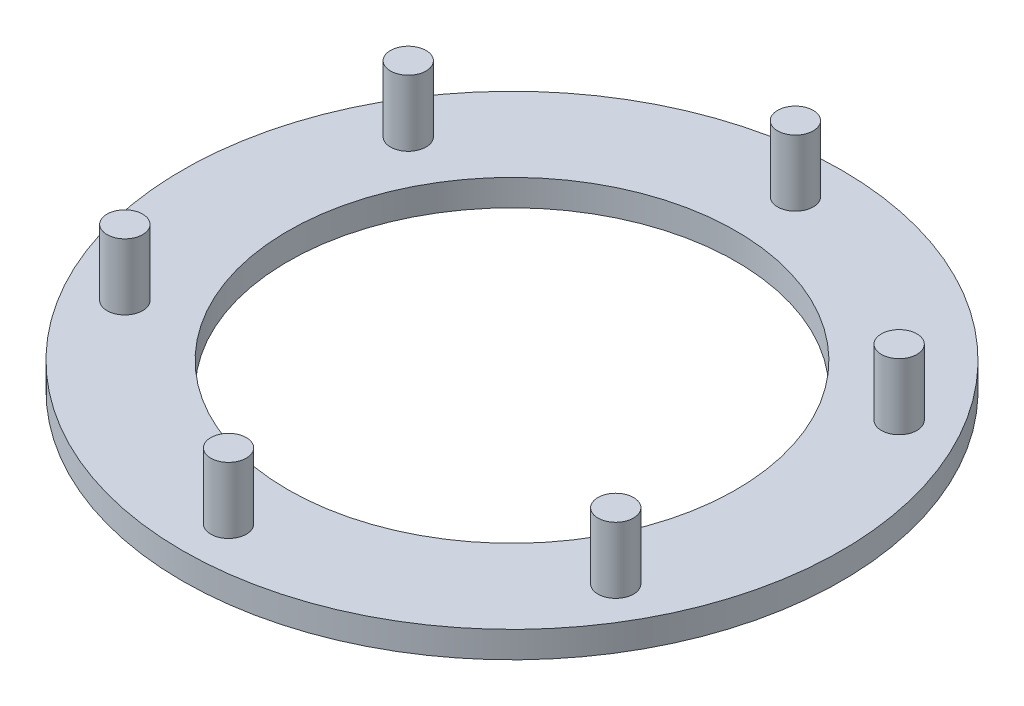
ISO-10303-21;
HEADER;
FILE_DESCRIPTION(('STEP AP214'),'2;1');
FILE_NAME('part.step','',(''),(''),'','','');
FILE_SCHEMA(('AUTOMOTIVE_DESIGN { 1 0 10303 214 1 1 1 1 }'));
ENDSEC;
DATA;
#1=APPLICATION_CONTEXT('core data for automotive mechanical design processes');
#2=APPLICATION_PROTOCOL_DEFINITION('international standard','automotive_design',2000,#1);
#3=PRODUCT_CONTEXT('',#1,'mechanical');
#4=PRODUCT('Part','Part','',(#3));
#5=PRODUCT_RELATED_PRODUCT_CATEGORY('part','',(#4));
#6=PRODUCT_DEFINITION_FORMATION('','',#4);
#7=PRODUCT_DEFINITION_CONTEXT('part definition',#1,'design');
#8=PRODUCT_DEFINITION('design','',#6,#7);
#9=PRODUCT_DEFINITION_SHAPE('','',#8);
#10=(LENGTH_UNIT() NAMED_UNIT(*) SI_UNIT(.MILLI.,.METRE.));
#11=(NAMED_UNIT(*) PLANE_ANGLE_UNIT() SI_UNIT($,.RADIAN.));
#12=(NAMED_UNIT(*) SI_UNIT($,.STERADIAN.) SOLID_ANGLE_UNIT());
#13=UNCERTAINTY_MEASURE_WITH_UNIT(LENGTH_MEASURE(1.E-05),#10,'distance_accuracy_value','');
#14=(GEOMETRIC_REPRESENTATION_CONTEXT(3) GLOBAL_UNCERTAINTY_ASSIGNED_CONTEXT((#13)) GLOBAL_UNIT_ASSIGNED_CONTEXT((#10,
#11,#12)) REPRESENTATION_CONTEXT('',''));
#15=CARTESIAN_POINT('',(0.,0.,0.));
#16=DIRECTION('',(0.,0.,1.));
#17=DIRECTION('',(1.,0.,0.));
#18=AXIS2_PLACEMENT_3D('',#15,#16,#17);
#19=CARTESIAN_POINT('',(0.,2.,0.));
#20=DIRECTION('',(0.,1.,0.));
#21=DIRECTION('',(0.,0.,1.));
#22=AXIS2_PLACEMENT_3D('',#19,#20,#21);
#23=PLANE('',#22);
#24=CARTESIAN_POINT('',(-18.6195461813636,2.,10.7500000000011));
#25=DIRECTION('',(0.,1.,0.));
#26=DIRECTION('',(0.,0.,1.));
#27=AXIS2_PLACEMENT_3D('',#24,#25,#26);
#28=CIRCLE('',#27,1.35);
#29=CARTESIAN_POINT('',(-18.6195461813636,2.,12.1000000000011));
#30=VERTEX_POINT('',#29);
#31=EDGE_CURVE('E67',#30,#30,#28,.T.);
#32=ORIENTED_EDGE('',*,*,#31,.F.);
#33=EDGE_LOOP('',(#32));
#34=FACE_BOUND('',#33,.T.);
#35=CARTESIAN_POINT('',(18.6195461813673,2.,10.7499999999989));
#36=DIRECTION('',(0.,1.,0.));
#37=DIRECTION('',(0.,0.,1.));
#38=AXIS2_PLACEMENT_3D('',#35,#36,#37);
#39=CIRCLE('',#38,1.35);
#40=CARTESIAN_POINT('',(18.6195461813673,2.,12.0999999999989));
#41=VERTEX_POINT('',#40);
#42=EDGE_CURVE('E61',#41,#41,#39,.T.);
#43=ORIENTED_EDGE('',*,*,#42,.F.);
#44=EDGE_LOOP('',(#43));
#45=FACE_BOUND('',#44,.T.);
#46=CARTESIAN_POINT('',(0.,2.,0.));
#47=DIRECTION('',(0.,1.,0.));
#48=DIRECTION('',(0.,0.,1.));
#49=AXIS2_PLACEMENT_3D('',#46,#47,#48);
#50=CIRCLE('',#49,17.);
#51=CARTESIAN_POINT('',(0.,2.,17.));
#52=VERTEX_POINT('',#51);
#53=EDGE_CURVE('E52',#52,#52,#50,.T.);
#54=ORIENTED_EDGE('',*,*,#53,.F.);
#55=EDGE_LOOP('',(#54));
#56=FACE_BOUND('',#55,.T.);
#57=CARTESIAN_POINT('',(0.,2.,0.));
#58=DIRECTION('',(0.,1.,0.));
#59=DIRECTION('',(0.,0.,1.));
#60=AXIS2_PLACEMENT_3D('',#57,#58,#59);
#61=CIRCLE('',#60,25.);
#62=CARTESIAN_POINT('',(0.,2.,25.));
#63=VERTEX_POINT('',#62);
#64=EDGE_CURVE('E10',#63,#63,#61,.T.);
#65=ORIENTED_EDGE('',*,*,#64,.T.);
#66=EDGE_LOOP('',(#65));
#67=FACE_BOUND('',#66,.T.);
#68=CARTESIAN_POINT('',(0.,2.,-21.5));
#69=DIRECTION('',(0.,1.,0.));
#70=DIRECTION('',(0.,0.,1.));
#71=AXIS2_PLACEMENT_3D('',#68,#69,#70);
#72=CIRCLE('',#71,1.35);
#73=CARTESIAN_POINT('',(0.,2.,-20.15));
#74=VERTEX_POINT('',#73);
#75=EDGE_CURVE('E48',#74,#74,#72,.T.);
#76=ORIENTED_EDGE('',*,*,#75,.F.);
#77=EDGE_LOOP('',(#76));
#78=FACE_BOUND('',#77,.T.);
#79=CARTESIAN_POINT('',(18.619546181366,2.,-10.7500000000011));
#80=DIRECTION('',(0.,1.,0.));
#81=DIRECTION('',(0.,0.,1.));
#82=AXIS2_PLACEMENT_3D('',#79,#80,#81);
#83=CIRCLE('',#82,1.35);
#84=CARTESIAN_POINT('',(18.619546181366,2.,-9.40000000000106));
#85=VERTEX_POINT('',#84);
#86=EDGE_CURVE('E56',#85,#85,#83,.T.);
#87=ORIENTED_EDGE('',*,*,#86,.F.);
#88=EDGE_LOOP('',(#87));
#89=FACE_BOUND('',#88,.T.);
#90=CARTESIAN_POINT('',(2.43636803916024E-12,2.,21.5));
#91=DIRECTION('',(0.,1.,0.));
#92=DIRECTION('',(0.,0.,1.));
#93=AXIS2_PLACEMENT_3D('',#90,#91,#92);
#94=CIRCLE('',#93,1.35);
#95=CARTESIAN_POINT('',(2.43636803916024E-12,2.,22.85));
#96=VERTEX_POINT('',#95);
#97=EDGE_CURVE('E64',#96,#96,#94,.T.);
#98=ORIENTED_EDGE('',*,*,#97,.F.);
#99=EDGE_LOOP('',(#98));
#100=FACE_BOUND('',#99,.T.);
#101=CARTESIAN_POINT('',(-18.6195461813648,2.,-10.7499999999989));
#102=DIRECTION('',(0.,1.,0.));
#103=DIRECTION('',(0.,0.,1.));
#104=AXIS2_PLACEMENT_3D('',#101,#102,#103);
#105=CIRCLE('',#104,1.35);
#106=CARTESIAN_POINT('',(-18.6195461813648,2.,-9.39999999999893));
#107=VERTEX_POINT('',#106);
#108=EDGE_CURVE('E70',#107,#107,#105,.T.);
#109=ORIENTED_EDGE('',*,*,#108,.F.);
#110=EDGE_LOOP('',(#109));
#111=FACE_BOUND('',#110,.T.);
#112=ADVANCED_FACE('F37',(#34,#45,#56,#67,#78,#89,#100,#111),#23,.T.);
#113=CARTESIAN_POINT('',(0.,0.,0.));
#114=DIRECTION('',(0.,1.,0.));
#115=DIRECTION('',(0.,0.,1.));
#116=AXIS2_PLACEMENT_3D('',#113,#114,#115);
#117=PLANE('',#116);
#118=CARTESIAN_POINT('',(0.,0.,0.));
#119=DIRECTION('',(0.,1.,0.));
#120=DIRECTION('',(0.,0.,1.));
#121=AXIS2_PLACEMENT_3D('',#118,#119,#120);
#122=CIRCLE('',#121,25.);
#123=CARTESIAN_POINT('',(0.,0.,25.));
#124=VERTEX_POINT('',#123);
#125=EDGE_CURVE('E41',#124,#124,#122,.T.);
#126=ORIENTED_EDGE('',*,*,#125,.F.);
#127=EDGE_LOOP('',(#126));
#128=FACE_BOUND('',#127,.T.);
#129=CARTESIAN_POINT('',(0.,0.,0.));
#130=DIRECTION('',(0.,1.,0.));
#131=DIRECTION('',(0.,0.,1.));
#132=AXIS2_PLACEMENT_3D('',#129,#130,#131);
#133=CIRCLE('',#132,17.);
#134=CARTESIAN_POINT('',(0.,0.,17.));
#135=VERTEX_POINT('',#134);
#136=EDGE_CURVE('E53',#135,#135,#133,.T.);
#137=ORIENTED_EDGE('',*,*,#136,.T.);
#138=EDGE_LOOP('',(#137));
#139=FACE_BOUND('',#138,.T.);
#140=ADVANCED_FACE('F108',(#128,#139),#117,.F.);
#141=CARTESIAN_POINT('',(0.,2.,0.));
#142=DIRECTION('',(0.,-1.,0.));
#143=DIRECTION('',(0.,0.,-1.));
#144=AXIS2_PLACEMENT_3D('',#141,#142,#143);
#145=CYLINDRICAL_SURFACE('',#144,25.);
#146=ORIENTED_EDGE('',*,*,#64,.F.);
#147=EDGE_LOOP('',(#146));
#148=FACE_BOUND('',#147,.T.);
#149=ORIENTED_EDGE('',*,*,#125,.T.);
#150=EDGE_LOOP('',(#149));
#151=FACE_BOUND('',#150,.T.);
#152=ADVANCED_FACE('F39',(#148,#151),#145,.T.);
#153=CARTESIAN_POINT('',(0.,2.,0.));
#154=DIRECTION('',(0.,-1.,0.));
#155=DIRECTION('',(0.,0.,-1.));
#156=AXIS2_PLACEMENT_3D('',#153,#154,#155);
#157=CYLINDRICAL_SURFACE('',#156,17.);
#158=ORIENTED_EDGE('',*,*,#53,.T.);
#159=EDGE_LOOP('',(#158));
#160=FACE_BOUND('',#159,.T.);
#161=ORIENTED_EDGE('',*,*,#136,.F.);
#162=EDGE_LOOP('',(#161));
#163=FACE_BOUND('',#162,.T.);
#164=ADVANCED_FACE('F118',(#160,#163),#157,.F.);
#165=CARTESIAN_POINT('',(-18.6195461813636,7.,10.7500000000011));
#166=DIRECTION('',(0.,-1.,0.));
#167=DIRECTION('',(0.,0.,-1.));
#168=AXIS2_PLACEMENT_3D('',#165,#166,#167);
#169=CYLINDRICAL_SURFACE('',#168,1.35);
#170=ORIENTED_EDGE('',*,*,#31,.T.);
#171=EDGE_LOOP('',(#170));
#172=FACE_BOUND('',#171,.T.);
#173=CARTESIAN_POINT('',(-18.6195461813636,7.,10.7500000000011));
#174=DIRECTION('',(0.,1.,0.));
#175=DIRECTION('',(0.,0.,1.));
#176=AXIS2_PLACEMENT_3D('',#173,#174,#175);
#177=CIRCLE('',#176,1.35);
#178=CARTESIAN_POINT('',(-18.6195461813636,7.,12.1000000000011));
#179=VERTEX_POINT('',#178);
#180=EDGE_CURVE('E73',#179,#179,#177,.T.);
#181=ORIENTED_EDGE('',*,*,#180,.F.);
#182=EDGE_LOOP('',(#181));
#183=FACE_BOUND('',#182,.T.);
#184=ADVANCED_FACE('F121',(#172,#183),#169,.T.);
#185=CARTESIAN_POINT('',(0.,7.,0.));
#186=DIRECTION('',(0.,1.,0.));
#187=DIRECTION('',(0.,0.,1.));
#188=AXIS2_PLACEMENT_3D('',#185,#186,#187);
#189=PLANE('',#188);
#190=ORIENTED_EDGE('',*,*,#180,.T.);
#191=EDGE_LOOP('',(#190));
#192=FACE_BOUND('',#191,.T.);
#193=ADVANCED_FACE('F125',(#192),#189,.T.);
#194=CARTESIAN_POINT('',(-18.6195461813648,7.,-10.7499999999989));
#195=DIRECTION('',(0.,-1.,0.));
#196=DIRECTION('',(0.,0.,-1.));
#197=AXIS2_PLACEMENT_3D('',#194,#195,#196);
#198=CYLINDRICAL_SURFACE('',#197,1.35);
#199=ORIENTED_EDGE('',*,*,#108,.T.);
#200=EDGE_LOOP('',(#199));
#201=FACE_BOUND('',#200,.T.);
#202=CARTESIAN_POINT('',(-18.6195461813648,7.,-10.7499999999989));
#203=DIRECTION('',(0.,1.,0.));
#204=DIRECTION('',(0.,0.,1.));
#205=AXIS2_PLACEMENT_3D('',#202,#203,#204);
#206=CIRCLE('',#205,1.35);
#207=CARTESIAN_POINT('',(-18.6195461813648,7.,-9.39999999999893));
#208=VERTEX_POINT('',#207);
#209=EDGE_CURVE('E76',#208,#208,#206,.T.);
#210=ORIENTED_EDGE('',*,*,#209,.F.);
#211=EDGE_LOOP('',(#210));
#212=FACE_BOUND('',#211,.T.);
#213=ADVANCED_FACE('F129',(#201,#212),#198,.T.);
#214=CARTESIAN_POINT('',(0.,7.,0.));
#215=DIRECTION('',(0.,1.,0.));
#216=DIRECTION('',(0.,0.,1.));
#217=AXIS2_PLACEMENT_3D('',#214,#215,#216);
#218=PLANE('',#217);
#219=ORIENTED_EDGE('',*,*,#209,.T.);
#220=EDGE_LOOP('',(#219));
#221=FACE_BOUND('',#220,.T.);
#222=ADVANCED_FACE('F133',(#221),#218,.T.);
#223=CARTESIAN_POINT('',(0.,7.,-21.5));
#224=DIRECTION('',(0.,-1.,0.));
#225=DIRECTION('',(0.,0.,-1.));
#226=AXIS2_PLACEMENT_3D('',#223,#224,#225);
#227=CYLINDRICAL_SURFACE('',#226,1.35);
#228=ORIENTED_EDGE('',*,*,#75,.T.);
#229=EDGE_LOOP('',(#228));
#230=FACE_BOUND('',#229,.T.);
#231=CARTESIAN_POINT('',(0.,7.,-21.5));
#232=DIRECTION('',(0.,1.,0.));
#233=DIRECTION('',(0.,0.,1.));
#234=AXIS2_PLACEMENT_3D('',#231,#232,#233);
#235=CIRCLE('',#234,1.35);
#236=CARTESIAN_POINT('',(0.,7.,-20.15));
#237=VERTEX_POINT('',#236);
#238=EDGE_CURVE('E79',#237,#237,#235,.T.);
#239=ORIENTED_EDGE('',*,*,#238,.F.);
#240=EDGE_LOOP('',(#239));
#241=FACE_BOUND('',#240,.T.);
#242=ADVANCED_FACE('F137',(#230,#241),#227,.T.);
#243=CARTESIAN_POINT('',(0.,7.,0.));
#244=DIRECTION('',(0.,1.,0.));
#245=DIRECTION('',(0.,0.,1.));
#246=AXIS2_PLACEMENT_3D('',#243,#244,#245);
#247=PLANE('',#246);
#248=ORIENTED_EDGE('',*,*,#238,.T.);
#249=EDGE_LOOP('',(#248));
#250=FACE_BOUND('',#249,.T.);
#251=ADVANCED_FACE('F141',(#250),#247,.T.);
#252=CARTESIAN_POINT('',(18.619546181366,7.,-10.7500000000011));
#253=DIRECTION('',(0.,-1.,0.));
#254=DIRECTION('',(0.,0.,-1.));
#255=AXIS2_PLACEMENT_3D('',#252,#253,#254);
#256=CYLINDRICAL_SURFACE('',#255,1.35);
#257=ORIENTED_EDGE('',*,*,#86,.T.);
#258=EDGE_LOOP('',(#257));
#259=FACE_BOUND('',#258,.T.);
#260=CARTESIAN_POINT('',(18.619546181366,7.,-10.7500000000011));
#261=DIRECTION('',(0.,1.,0.));
#262=DIRECTION('',(0.,0.,1.));
#263=AXIS2_PLACEMENT_3D('',#260,#261,#262);
#264=CIRCLE('',#263,1.35);
#265=CARTESIAN_POINT('',(18.619546181366,7.,-9.40000000000106));
#266=VERTEX_POINT('',#265);
#267=EDGE_CURVE('E82',#266,#266,#264,.T.);
#268=ORIENTED_EDGE('',*,*,#267,.F.);
#269=EDGE_LOOP('',(#268));
#270=FACE_BOUND('',#269,.T.);
#271=ADVANCED_FACE('F145',(#259,#270),#256,.T.);
#272=CARTESIAN_POINT('',(0.,7.,0.));
#273=DIRECTION('',(0.,1.,0.));
#274=DIRECTION('',(0.,0.,1.));
#275=AXIS2_PLACEMENT_3D('',#272,#273,#274);
#276=PLANE('',#275);
#277=ORIENTED_EDGE('',*,*,#267,.T.);
#278=EDGE_LOOP('',(#277));
#279=FACE_BOUND('',#278,.T.);
#280=ADVANCED_FACE('F149',(#279),#276,.T.);
#281=CARTESIAN_POINT('',(18.6195461813673,7.,10.7499999999989));
#282=DIRECTION('',(0.,-1.,0.));
#283=DIRECTION('',(0.,0.,-1.));
#284=AXIS2_PLACEMENT_3D('',#281,#282,#283);
#285=CYLINDRICAL_SURFACE('',#284,1.35);
#286=ORIENTED_EDGE('',*,*,#42,.T.);
#287=EDGE_LOOP('',(#286));
#288=FACE_BOUND('',#287,.T.);
#289=CARTESIAN_POINT('',(18.6195461813673,7.,10.7499999999989));
#290=DIRECTION('',(0.,1.,0.));
#291=DIRECTION('',(0.,0.,1.));
#292=AXIS2_PLACEMENT_3D('',#289,#290,#291);
#293=CIRCLE('',#292,1.35);
#294=CARTESIAN_POINT('',(18.6195461813673,7.,12.0999999999989));
#295=VERTEX_POINT('',#294);
#296=EDGE_CURVE('E85',#295,#295,#293,.T.);
#297=ORIENTED_EDGE('',*,*,#296,.F.);
#298=EDGE_LOOP('',(#297));
#299=FACE_BOUND('',#298,.T.);
#300=ADVANCED_FACE('F104',(#288,#299),#285,.T.);
#301=CARTESIAN_POINT('',(0.,7.,0.));
#302=DIRECTION('',(0.,1.,0.));
#303=DIRECTION('',(0.,0.,1.));
#304=AXIS2_PLACEMENT_3D('',#301,#302,#303);
#305=PLANE('',#304);
#306=ORIENTED_EDGE('',*,*,#296,.T.);
#307=EDGE_LOOP('',(#306));
#308=FACE_BOUND('',#307,.T.);
#309=ADVANCED_FACE('F96',(#308),#305,.T.);
#310=CARTESIAN_POINT('',(2.43636803916024E-12,7.,21.5));
#311=DIRECTION('',(0.,-1.,0.));
#312=DIRECTION('',(0.,0.,-1.));
#313=AXIS2_PLACEMENT_3D('',#310,#311,#312);
#314=CYLINDRICAL_SURFACE('',#313,1.35);
#315=ORIENTED_EDGE('',*,*,#97,.T.);
#316=EDGE_LOOP('',(#315));
#317=FACE_BOUND('',#316,.T.);
#318=CARTESIAN_POINT('',(2.43636803916024E-12,7.,21.5));
#319=DIRECTION('',(0.,1.,0.));
#320=DIRECTION('',(0.,0.,1.));
#321=AXIS2_PLACEMENT_3D('',#318,#319,#320);
#322=CIRCLE('',#321,1.35);
#323=CARTESIAN_POINT('',(2.43636803916024E-12,7.,22.85));
#324=VERTEX_POINT('',#323);
#325=EDGE_CURVE('E88',#324,#324,#322,.T.);
#326=ORIENTED_EDGE('',*,*,#325,.F.);
#327=EDGE_LOOP('',(#326));
#328=FACE_BOUND('',#327,.T.);
#329=ADVANCED_FACE('F94',(#317,#328),#314,.T.);
#330=CARTESIAN_POINT('',(0.,7.,0.));
#331=DIRECTION('',(0.,1.,0.));
#332=DIRECTION('',(0.,0.,1.));
#333=AXIS2_PLACEMENT_3D('',#330,#331,#332);
#334=PLANE('',#333);
#335=ORIENTED_EDGE('',*,*,#325,.T.);
#336=EDGE_LOOP('',(#335));
#337=FACE_BOUND('',#336,.T.);
#338=ADVANCED_FACE('F92',(#337),#334,.T.);
#339=CLOSED_SHELL('',(#112,#140,#152,#164,#184,#193,#213,#222,#242,#251,#271,#280,#300,#309,
#329,#338));
#340=MANIFOLD_SOLID_BREP('B2',#339);
#341=ADVANCED_BREP_SHAPE_REPRESENTATION('',(#18,#340),#14);
#342=SHAPE_DEFINITION_REPRESENTATION(#9,#341);
ENDSEC;
END-ISO-10303-21;
